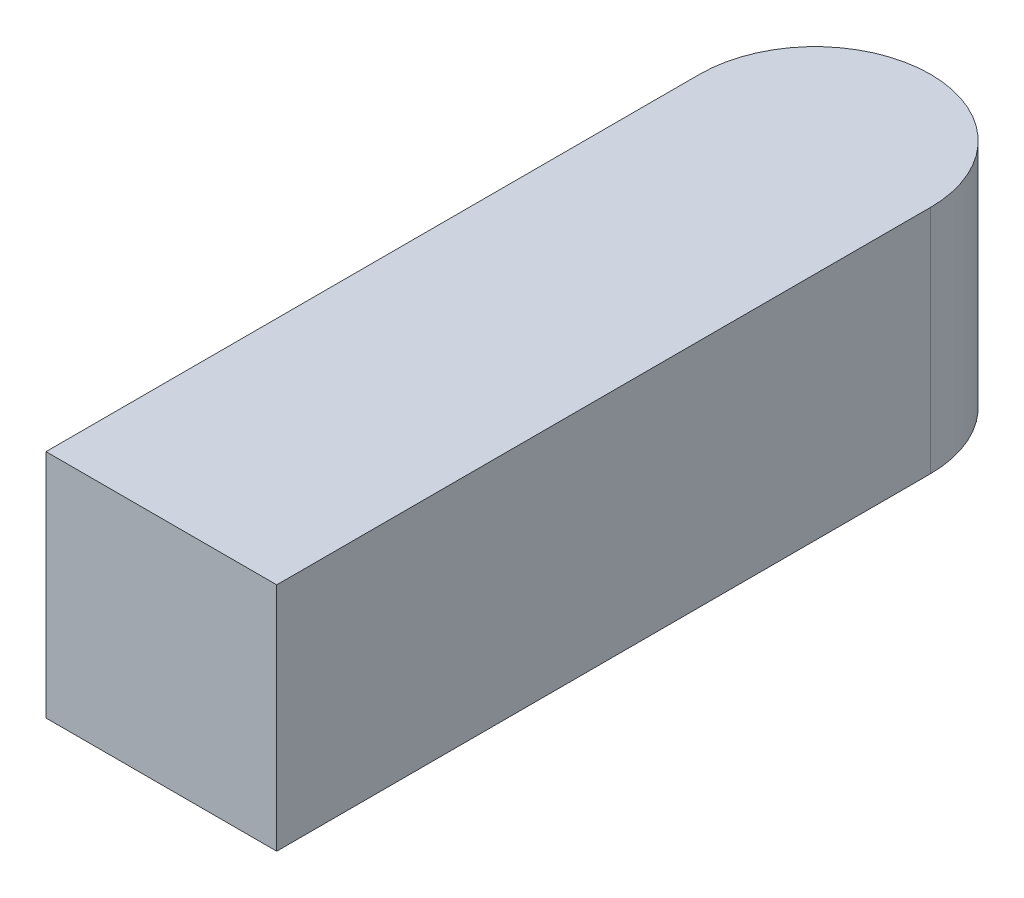
ISO-10303-21;
HEADER;
FILE_DESCRIPTION(('STEP AP214'),'2;1');
FILE_NAME('part.step','',(''),(''),'','','');
FILE_SCHEMA(('AUTOMOTIVE_DESIGN { 1 0 10303 214 1 1 1 1 }'));
ENDSEC;
DATA;
#1=APPLICATION_CONTEXT('core data for automotive mechanical design processes');
#2=APPLICATION_PROTOCOL_DEFINITION('international standard','automotive_design',2000,#1);
#3=PRODUCT_CONTEXT('',#1,'mechanical');
#4=PRODUCT('Part','Part','',(#3));
#5=PRODUCT_RELATED_PRODUCT_CATEGORY('part','',(#4));
#6=PRODUCT_DEFINITION_FORMATION('','',#4);
#7=PRODUCT_DEFINITION_CONTEXT('part definition',#1,'design');
#8=PRODUCT_DEFINITION('design','',#6,#7);
#9=PRODUCT_DEFINITION_SHAPE('','',#8);
#10=(LENGTH_UNIT() NAMED_UNIT(*) SI_UNIT(.MILLI.,.METRE.));
#11=(NAMED_UNIT(*) PLANE_ANGLE_UNIT() SI_UNIT($,.RADIAN.));
#12=(NAMED_UNIT(*) SI_UNIT($,.STERADIAN.) SOLID_ANGLE_UNIT());
#13=UNCERTAINTY_MEASURE_WITH_UNIT(LENGTH_MEASURE(1.E-05),#10,'distance_accuracy_value','');
#14=(GEOMETRIC_REPRESENTATION_CONTEXT(3) GLOBAL_UNCERTAINTY_ASSIGNED_CONTEXT((#13)) GLOBAL_UNIT_ASSIGNED_CONTEXT((#10,
#11,#12)) REPRESENTATION_CONTEXT('',''));
#15=CARTESIAN_POINT('',(0.,0.,0.));
#16=DIRECTION('',(0.,0.,1.));
#17=DIRECTION('',(1.,0.,0.));
#18=AXIS2_PLACEMENT_3D('',#15,#16,#17);
#19=CARTESIAN_POINT('',(1.5,1.5,-4.25));
#20=DIRECTION('',(-1.,0.,0.));
#21=DIRECTION('',(0.,0.,1.));
#22=AXIS2_PLACEMENT_3D('',#19,#20,#21);
#23=PLANE('',#22);
#24=DIRECTION('',(0.,0.,-1.));
#25=VECTOR('',#24,1.);
#26=CARTESIAN_POINT('',(1.5,-1.5,-4.25));
#27=LINE('',#26,#25);
#28=CARTESIAN_POINT('',(1.5,-1.5,4.25));
#29=VERTEX_POINT('',#28);
#30=CARTESIAN_POINT('',(1.5,-1.5,-4.25));
#31=VERTEX_POINT('',#30);
#32=EDGE_CURVE('E96',#29,#31,#27,.T.);
#33=ORIENTED_EDGE('',*,*,#32,.T.);
#34=DIRECTION('',(0.,-1.,0.));
#35=VECTOR('',#34,1.);
#36=CARTESIAN_POINT('',(1.5,1.5,-4.25));
#37=LINE('',#36,#35);
#38=CARTESIAN_POINT('',(1.5,1.5,-4.25));
#39=VERTEX_POINT('',#38);
#40=EDGE_CURVE('E11',#39,#31,#37,.T.);
#41=ORIENTED_EDGE('',*,*,#40,.F.);
#42=DIRECTION('',(0.,0.,-1.));
#43=VECTOR('',#42,1.);
#44=CARTESIAN_POINT('',(1.5,1.5,-4.25));
#45=LINE('',#44,#43);
#46=CARTESIAN_POINT('',(1.5,1.5,4.25));
#47=VERTEX_POINT('',#46);
#48=EDGE_CURVE('E84',#47,#39,#45,.T.);
#49=ORIENTED_EDGE('',*,*,#48,.F.);
#50=DIRECTION('',(0.,-1.,0.));
#51=VECTOR('',#50,1.);
#52=CARTESIAN_POINT('',(1.5,1.5,4.25));
#53=LINE('',#52,#51);
#54=EDGE_CURVE('E92',#47,#29,#53,.T.);
#55=ORIENTED_EDGE('',*,*,#54,.T.);
#56=EDGE_LOOP('',(#33,#41,#49,#55));
#57=FACE_BOUND('',#56,.T.);
#58=ADVANCED_FACE('F33',(#57),#23,.F.);
#59=CARTESIAN_POINT('',(0.,1.5,-4.25));
#60=DIRECTION('',(0.,-1.,0.));
#61=DIRECTION('',(0.,0.,-1.));
#62=AXIS2_PLACEMENT_3D('',#59,#60,#61);
#63=CYLINDRICAL_SURFACE('',#62,1.5);
#64=CARTESIAN_POINT('',(0.,-1.5,-4.25));
#65=DIRECTION('',(0.,1.,0.));
#66=DIRECTION('',(0.,0.,-1.));
#67=AXIS2_PLACEMENT_3D('',#64,#65,#66);
#68=CIRCLE('',#67,1.5);
#69=CARTESIAN_POINT('',(-1.5,-1.5,-4.25));
#70=VERTEX_POINT('',#69);
#71=EDGE_CURVE('E88',#31,#70,#68,.T.);
#72=ORIENTED_EDGE('',*,*,#71,.T.);
#73=DIRECTION('',(0.,-1.,0.));
#74=VECTOR('',#73,1.);
#75=CARTESIAN_POINT('',(-1.5,1.5,-4.25));
#76=LINE('',#75,#74);
#77=CARTESIAN_POINT('',(-1.5,1.5,-4.25));
#78=VERTEX_POINT('',#77);
#79=EDGE_CURVE('E41',#78,#70,#76,.T.);
#80=ORIENTED_EDGE('',*,*,#79,.F.);
#81=CARTESIAN_POINT('',(0.,1.5,-4.25));
#82=DIRECTION('',(0.,1.,0.));
#83=DIRECTION('',(0.,0.,-1.));
#84=AXIS2_PLACEMENT_3D('',#81,#82,#83);
#85=CIRCLE('',#84,1.5);
#86=EDGE_CURVE('E79',#39,#78,#85,.T.);
#87=ORIENTED_EDGE('',*,*,#86,.F.);
#88=ORIENTED_EDGE('',*,*,#40,.T.);
#89=EDGE_LOOP('',(#72,#80,#87,#88));
#90=FACE_BOUND('',#89,.T.);
#91=ADVANCED_FACE('F87',(#90),#63,.T.);
#92=CARTESIAN_POINT('',(-1.5,1.5,-4.25));
#93=DIRECTION('',(1.,0.,0.));
#94=DIRECTION('',(0.,0.,-1.));
#95=AXIS2_PLACEMENT_3D('',#92,#93,#94);
#96=PLANE('',#95);
#97=DIRECTION('',(0.,0.,1.));
#98=VECTOR('',#97,1.);
#99=CARTESIAN_POINT('',(-1.5,-1.5,-4.25));
#100=LINE('',#99,#98);
#101=CARTESIAN_POINT('',(-1.5,-1.5,4.25));
#102=VERTEX_POINT('',#101);
#103=EDGE_CURVE('E66',#70,#102,#100,.T.);
#104=ORIENTED_EDGE('',*,*,#103,.T.);
#105=DIRECTION('',(0.,-1.,0.));
#106=VECTOR('',#105,1.);
#107=CARTESIAN_POINT('',(-1.5,1.5,4.25));
#108=LINE('',#107,#106);
#109=CARTESIAN_POINT('',(-1.5,1.5,4.25));
#110=VERTEX_POINT('',#109);
#111=EDGE_CURVE('E89',#110,#102,#108,.T.);
#112=ORIENTED_EDGE('',*,*,#111,.F.);
#113=DIRECTION('',(0.,0.,1.));
#114=VECTOR('',#113,1.);
#115=CARTESIAN_POINT('',(-1.5,1.5,-4.25));
#116=LINE('',#115,#114);
#117=EDGE_CURVE('E82',#78,#110,#116,.T.);
#118=ORIENTED_EDGE('',*,*,#117,.F.);
#119=ORIENTED_EDGE('',*,*,#79,.T.);
#120=EDGE_LOOP('',(#104,#112,#118,#119));
#121=FACE_BOUND('',#120,.T.);
#122=ADVANCED_FACE('F90',(#121),#96,.F.);
#123=CARTESIAN_POINT('',(-1.5,1.5,4.25));
#124=DIRECTION('',(0.,0.,-1.));
#125=DIRECTION('',(-1.,0.,0.));
#126=AXIS2_PLACEMENT_3D('',#123,#124,#125);
#127=PLANE('',#126);
#128=DIRECTION('',(1.,0.,0.));
#129=VECTOR('',#128,1.);
#130=CARTESIAN_POINT('',(-1.5,-1.5,4.25));
#131=LINE('',#130,#129);
#132=EDGE_CURVE('E72',#102,#29,#131,.T.);
#133=ORIENTED_EDGE('',*,*,#132,.T.);
#134=ORIENTED_EDGE('',*,*,#54,.F.);
#135=DIRECTION('',(1.,0.,0.));
#136=VECTOR('',#135,1.);
#137=CARTESIAN_POINT('',(-1.5,1.5,4.25));
#138=LINE('',#137,#136);
#139=EDGE_CURVE('E49',#110,#47,#138,.T.);
#140=ORIENTED_EDGE('',*,*,#139,.F.);
#141=ORIENTED_EDGE('',*,*,#111,.T.);
#142=EDGE_LOOP('',(#133,#134,#140,#141));
#143=FACE_BOUND('',#142,.T.);
#144=ADVANCED_FACE('F103',(#143),#127,.F.);
#145=CARTESIAN_POINT('',(0.,1.5,-4.25));
#146=DIRECTION('',(0.,-1.,0.));
#147=DIRECTION('',(0.,0.,-1.));
#148=AXIS2_PLACEMENT_3D('',#145,#146,#147);
#149=PLANE('',#148);
#150=ORIENTED_EDGE('',*,*,#48,.T.);
#151=ORIENTED_EDGE('',*,*,#86,.T.);
#152=ORIENTED_EDGE('',*,*,#117,.T.);
#153=ORIENTED_EDGE('',*,*,#139,.T.);
#154=EDGE_LOOP('',(#150,#151,#152,#153));
#155=FACE_BOUND('',#154,.T.);
#156=ADVANCED_FACE('F80',(#155),#149,.F.);
#157=CARTESIAN_POINT('',(0.,-1.5,-4.25));
#158=DIRECTION('',(0.,-1.,0.));
#159=DIRECTION('',(0.,0.,-1.));
#160=AXIS2_PLACEMENT_3D('',#157,#158,#159);
#161=PLANE('',#160);
#162=ORIENTED_EDGE('',*,*,#32,.F.);
#163=ORIENTED_EDGE('',*,*,#132,.F.);
#164=ORIENTED_EDGE('',*,*,#103,.F.);
#165=ORIENTED_EDGE('',*,*,#71,.F.);
#166=EDGE_LOOP('',(#162,#163,#164,#165));
#167=FACE_BOUND('',#166,.T.);
#168=ADVANCED_FACE('F106',(#167),#161,.T.);
#169=CLOSED_SHELL('',(#58,#91,#122,#144,#156,#168));
#170=MANIFOLD_SOLID_BREP('B2',#169);
#171=ADVANCED_BREP_SHAPE_REPRESENTATION('',(#18,#170),#14);
#172=SHAPE_DEFINITION_REPRESENTATION(#9,#171);
ENDSEC;
END-ISO-10303-21;
